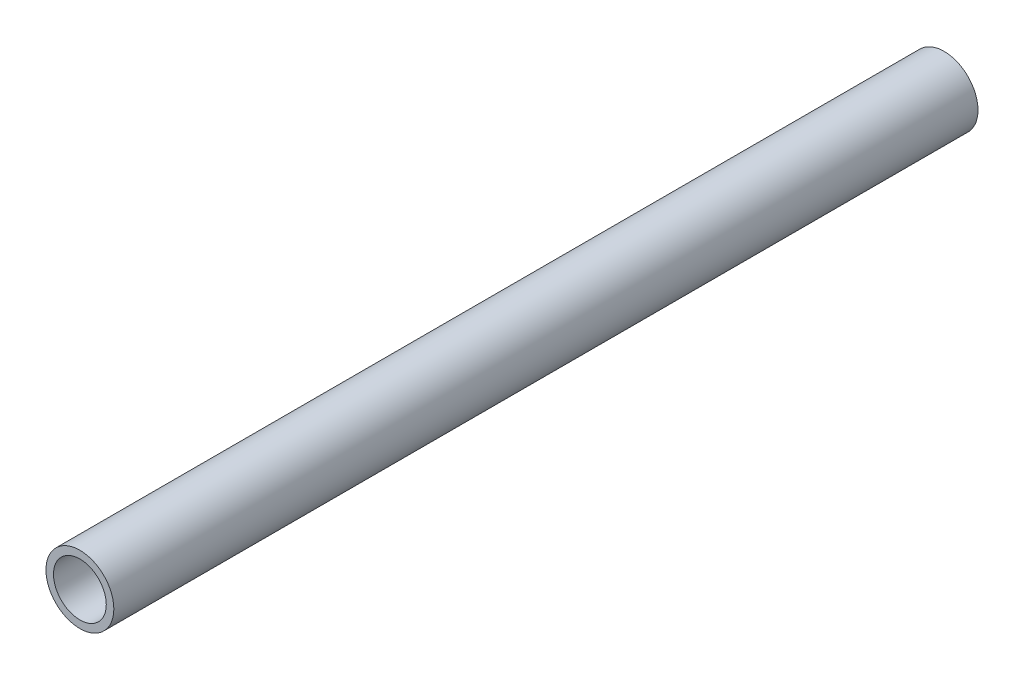
ISO-10303-21;
HEADER;
FILE_DESCRIPTION(('STEP AP214'),'2;1');
FILE_NAME('part.step','',(''),(''),'','','');
FILE_SCHEMA(('AUTOMOTIVE_DESIGN { 1 0 10303 214 1 1 1 1 }'));
ENDSEC;
DATA;
#1=APPLICATION_CONTEXT('core data for automotive mechanical design processes');
#2=APPLICATION_PROTOCOL_DEFINITION('international standard','automotive_design',2000,#1);
#3=PRODUCT_CONTEXT('',#1,'mechanical');
#4=PRODUCT('Part','Part','',(#3));
#5=PRODUCT_RELATED_PRODUCT_CATEGORY('part','',(#4));
#6=PRODUCT_DEFINITION_FORMATION('','',#4);
#7=PRODUCT_DEFINITION_CONTEXT('part definition',#1,'design');
#8=PRODUCT_DEFINITION('design','',#6,#7);
#9=PRODUCT_DEFINITION_SHAPE('','',#8);
#10=(LENGTH_UNIT() NAMED_UNIT(*) SI_UNIT(.MILLI.,.METRE.));
#11=(NAMED_UNIT(*) PLANE_ANGLE_UNIT() SI_UNIT($,.RADIAN.));
#12=(NAMED_UNIT(*) SI_UNIT($,.STERADIAN.) SOLID_ANGLE_UNIT());
#13=UNCERTAINTY_MEASURE_WITH_UNIT(LENGTH_MEASURE(1.E-05),#10,'distance_accuracy_value','');
#14=(GEOMETRIC_REPRESENTATION_CONTEXT(3) GLOBAL_UNCERTAINTY_ASSIGNED_CONTEXT((#13)) GLOBAL_UNIT_ASSIGNED_CONTEXT((#10,
#11,#12)) REPRESENTATION_CONTEXT('',''));
#15=CARTESIAN_POINT('',(0.,0.,0.));
#16=DIRECTION('',(0.,0.,1.));
#17=DIRECTION('',(1.,0.,0.));
#18=AXIS2_PLACEMENT_3D('',#15,#16,#17);
#19=CARTESIAN_POINT('',(0.,0.,229.14));
#20=DIRECTION('',(0.,0.,1.));
#21=DIRECTION('',(1.,0.,0.));
#22=AXIS2_PLACEMENT_3D('',#19,#20,#21);
#23=PLANE('',#22);
#24=CARTESIAN_POINT('',(0.,0.,229.14));
#25=DIRECTION('',(0.,0.,1.));
#26=DIRECTION('',(1.,0.,0.));
#27=AXIS2_PLACEMENT_3D('',#24,#25,#26);
#28=CIRCLE('',#27,9.);
#29=CARTESIAN_POINT('',(9.,0.,229.14));
#30=VERTEX_POINT('',#29);
#31=EDGE_CURVE('E10',#30,#30,#28,.T.);
#32=ORIENTED_EDGE('',*,*,#31,.T.);
#33=EDGE_LOOP('',(#32));
#34=FACE_BOUND('',#33,.T.);
#35=CARTESIAN_POINT('',(0.,0.,229.14));
#36=DIRECTION('',(0.,0.,1.));
#37=DIRECTION('',(1.,0.,0.));
#38=AXIS2_PLACEMENT_3D('',#35,#36,#37);
#39=CIRCLE('',#38,7.);
#40=CARTESIAN_POINT('',(7.,0.,229.14));
#41=VERTEX_POINT('',#40);
#42=EDGE_CURVE('E50',#41,#41,#39,.T.);
#43=ORIENTED_EDGE('',*,*,#42,.F.);
#44=EDGE_LOOP('',(#43));
#45=FACE_BOUND('',#44,.T.);
#46=ADVANCED_FACE('F37',(#34,#45),#23,.T.);
#47=CARTESIAN_POINT('',(0.,0.,0.));
#48=DIRECTION('',(0.,0.,1.));
#49=DIRECTION('',(1.,0.,0.));
#50=AXIS2_PLACEMENT_3D('',#47,#48,#49);
#51=PLANE('',#50);
#52=CARTESIAN_POINT('',(0.,0.,0.));
#53=DIRECTION('',(0.,0.,1.));
#54=DIRECTION('',(1.,0.,0.));
#55=AXIS2_PLACEMENT_3D('',#52,#53,#54);
#56=CIRCLE('',#55,9.);
#57=CARTESIAN_POINT('',(9.,0.,0.));
#58=VERTEX_POINT('',#57);
#59=EDGE_CURVE('E41',#58,#58,#56,.T.);
#60=ORIENTED_EDGE('',*,*,#59,.F.);
#61=EDGE_LOOP('',(#60));
#62=FACE_BOUND('',#61,.T.);
#63=CARTESIAN_POINT('',(0.,0.,0.));
#64=DIRECTION('',(0.,0.,1.));
#65=DIRECTION('',(1.,0.,0.));
#66=AXIS2_PLACEMENT_3D('',#63,#64,#65);
#67=CIRCLE('',#66,7.);
#68=CARTESIAN_POINT('',(7.,0.,0.));
#69=VERTEX_POINT('',#68);
#70=EDGE_CURVE('E52',#69,#69,#67,.T.);
#71=ORIENTED_EDGE('',*,*,#70,.T.);
#72=EDGE_LOOP('',(#71));
#73=FACE_BOUND('',#72,.T.);
#74=ADVANCED_FACE('F64',(#62,#73),#51,.F.);
#75=CARTESIAN_POINT('',(0.,0.,229.14));
#76=DIRECTION('',(0.,0.,-1.));
#77=DIRECTION('',(-1.,0.,0.));
#78=AXIS2_PLACEMENT_3D('',#75,#76,#77);
#79=CYLINDRICAL_SURFACE('',#78,9.);
#80=ORIENTED_EDGE('',*,*,#31,.F.);
#81=EDGE_LOOP('',(#80));
#82=FACE_BOUND('',#81,.T.);
#83=ORIENTED_EDGE('',*,*,#59,.T.);
#84=EDGE_LOOP('',(#83));
#85=FACE_BOUND('',#84,.T.);
#86=ADVANCED_FACE('F39',(#82,#85),#79,.T.);
#87=CARTESIAN_POINT('',(0.,0.,229.14));
#88=DIRECTION('',(0.,0.,-1.));
#89=DIRECTION('',(-1.,0.,0.));
#90=AXIS2_PLACEMENT_3D('',#87,#88,#89);
#91=CYLINDRICAL_SURFACE('',#90,7.);
#92=ORIENTED_EDGE('',*,*,#42,.T.);
#93=EDGE_LOOP('',(#92));
#94=FACE_BOUND('',#93,.T.);
#95=ORIENTED_EDGE('',*,*,#70,.F.);
#96=EDGE_LOOP('',(#95));
#97=FACE_BOUND('',#96,.T.);
#98=ADVANCED_FACE('F60',(#94,#97),#91,.F.);
#99=CLOSED_SHELL('',(#46,#74,#86,#98));
#100=MANIFOLD_SOLID_BREP('B2',#99);
#101=ADVANCED_BREP_SHAPE_REPRESENTATION('',(#18,#100),#14);
#102=SHAPE_DEFINITION_REPRESENTATION(#9,#101);
ENDSEC;
END-ISO-10303-21;
